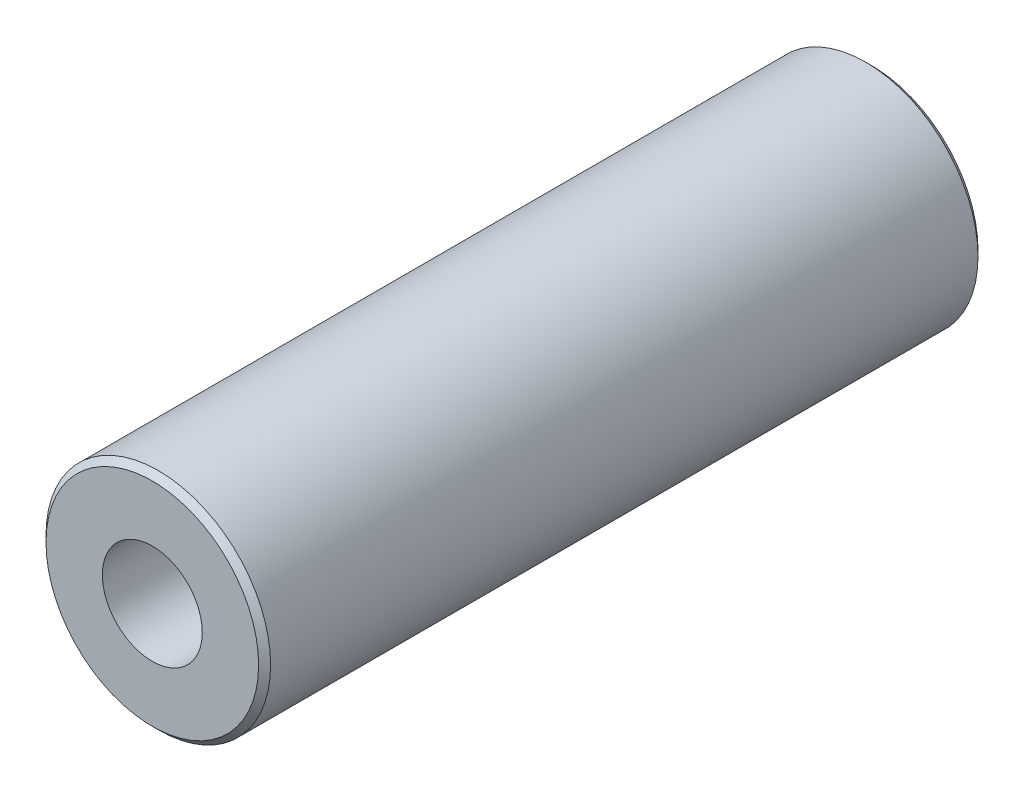
ISO-10303-21;
HEADER;
FILE_DESCRIPTION(('STEP AP214'),'2;1');
FILE_NAME('part.step','',(''),(''),'','','');
FILE_SCHEMA(('AUTOMOTIVE_DESIGN { 1 0 10303 214 1 1 1 1 }'));
ENDSEC;
DATA;
#1=APPLICATION_CONTEXT('core data for automotive mechanical design processes');
#2=APPLICATION_PROTOCOL_DEFINITION('international standard','automotive_design',2000,#1);
#3=PRODUCT_CONTEXT('',#1,'mechanical');
#4=PRODUCT('Part','Part','',(#3));
#5=PRODUCT_RELATED_PRODUCT_CATEGORY('part','',(#4));
#6=PRODUCT_DEFINITION_FORMATION('','',#4);
#7=PRODUCT_DEFINITION_CONTEXT('part definition',#1,'design');
#8=PRODUCT_DEFINITION('design','',#6,#7);
#9=PRODUCT_DEFINITION_SHAPE('','',#8);
#10=(LENGTH_UNIT() NAMED_UNIT(*) SI_UNIT(.MILLI.,.METRE.));
#11=(NAMED_UNIT(*) PLANE_ANGLE_UNIT() SI_UNIT($,.RADIAN.));
#12=(NAMED_UNIT(*) SI_UNIT($,.STERADIAN.) SOLID_ANGLE_UNIT());
#13=UNCERTAINTY_MEASURE_WITH_UNIT(LENGTH_MEASURE(1.E-05),#10,'distance_accuracy_value','');
#14=(GEOMETRIC_REPRESENTATION_CONTEXT(3) GLOBAL_UNCERTAINTY_ASSIGNED_CONTEXT((#13)) GLOBAL_UNIT_ASSIGNED_CONTEXT((#10,
#11,#12)) REPRESENTATION_CONTEXT('',''));
#15=CARTESIAN_POINT('',(0.,0.,0.));
#16=DIRECTION('',(0.,0.,1.));
#17=DIRECTION('',(1.,0.,0.));
#18=AXIS2_PLACEMENT_3D('',#15,#16,#17);
#19=CARTESIAN_POINT('',(0.,0.,-45.72));
#20=DIRECTION('',(0.,0.,1.));
#21=DIRECTION('',(1.,0.,0.));
#22=AXIS2_PLACEMENT_3D('',#19,#20,#21);
#23=CYLINDRICAL_SURFACE('',#22,7.1374);
#24=CARTESIAN_POINT('',(0.,0.,-0.380999999999999));
#25=DIRECTION('',(0.,0.,1.));
#26=DIRECTION('',(1.,0.,0.));
#27=AXIS2_PLACEMENT_3D('',#24,#25,#26);
#28=CIRCLE('',#27,7.1374);
#29=CARTESIAN_POINT('',(7.1374,0.,-0.380999999999999));
#30=VERTEX_POINT('',#29);
#31=EDGE_CURVE('E42',#30,#30,#28,.F.);
#32=ORIENTED_EDGE('',*,*,#31,.T.);
#33=EDGE_LOOP('',(#32));
#34=FACE_BOUND('',#33,.T.);
#35=CARTESIAN_POINT('',(0.,0.,-45.339));
#36=DIRECTION('',(0.,0.,1.));
#37=DIRECTION('',(1.,0.,0.));
#38=AXIS2_PLACEMENT_3D('',#35,#36,#37);
#39=CIRCLE('',#38,7.1374);
#40=CARTESIAN_POINT('',(7.1374,0.,-45.339));
#41=VERTEX_POINT('',#40);
#42=EDGE_CURVE('E46',#41,#41,#39,.T.);
#43=ORIENTED_EDGE('',*,*,#42,.T.);
#44=EDGE_LOOP('',(#43));
#45=FACE_BOUND('',#44,.T.);
#46=ADVANCED_FACE('F35',(#34,#45),#23,.T.);
#47=CARTESIAN_POINT('',(0.,0.,-45.72));
#48=DIRECTION('',(0.,0.,1.));
#49=DIRECTION('',(1.,0.,0.));
#50=AXIS2_PLACEMENT_3D('',#47,#48,#49);
#51=PLANE('',#50);
#52=CARTESIAN_POINT('',(0.,0.,-45.72));
#53=DIRECTION('',(0.,0.,1.));
#54=DIRECTION('',(1.,0.,0.));
#55=AXIS2_PLACEMENT_3D('',#52,#53,#54);
#56=CIRCLE('',#55,6.75640000000001);
#57=CARTESIAN_POINT('',(6.75640000000001,0.,-45.72));
#58=VERTEX_POINT('',#57);
#59=EDGE_CURVE('E10',#58,#58,#56,.F.);
#60=ORIENTED_EDGE('',*,*,#59,.T.);
#61=EDGE_LOOP('',(#60));
#62=FACE_BOUND('',#61,.T.);
#63=CARTESIAN_POINT('',(0.,0.,-45.72));
#64=DIRECTION('',(0.,0.,1.));
#65=DIRECTION('',(1.,0.,0.));
#66=AXIS2_PLACEMENT_3D('',#63,#64,#65);
#67=CIRCLE('',#66,3.175);
#68=CARTESIAN_POINT('',(3.175,0.,-45.72));
#69=VERTEX_POINT('',#68);
#70=EDGE_CURVE('E55',#69,#69,#67,.T.);
#71=ORIENTED_EDGE('',*,*,#70,.T.);
#72=EDGE_LOOP('',(#71));
#73=FACE_BOUND('',#72,.T.);
#74=ADVANCED_FACE('F62',(#62,#73),#51,.F.);
#75=CARTESIAN_POINT('',(0.,0.,0.));
#76=DIRECTION('',(0.,0.,1.));
#77=DIRECTION('',(1.,0.,0.));
#78=AXIS2_PLACEMENT_3D('',#75,#76,#77);
#79=PLANE('',#78);
#80=CARTESIAN_POINT('',(0.,0.,0.));
#81=DIRECTION('',(0.,0.,1.));
#82=DIRECTION('',(1.,0.,0.));
#83=AXIS2_PLACEMENT_3D('',#80,#81,#82);
#84=CIRCLE('',#83,6.7564);
#85=CARTESIAN_POINT('',(6.7564,0.,0.));
#86=VERTEX_POINT('',#85);
#87=EDGE_CURVE('E50',#86,#86,#84,.T.);
#88=ORIENTED_EDGE('',*,*,#87,.T.);
#89=EDGE_LOOP('',(#88));
#90=FACE_BOUND('',#89,.T.);
#91=CARTESIAN_POINT('',(0.,0.,0.));
#92=DIRECTION('',(0.,0.,1.));
#93=DIRECTION('',(1.,0.,0.));
#94=AXIS2_PLACEMENT_3D('',#91,#92,#93);
#95=CIRCLE('',#94,3.175);
#96=CARTESIAN_POINT('',(3.175,0.,0.));
#97=VERTEX_POINT('',#96);
#98=EDGE_CURVE('E56',#97,#97,#95,.T.);
#99=ORIENTED_EDGE('',*,*,#98,.F.);
#100=EDGE_LOOP('',(#99));
#101=FACE_BOUND('',#100,.T.);
#102=ADVANCED_FACE('F68',(#90,#101),#79,.T.);
#103=CARTESIAN_POINT('',(0.,0.,-45.72));
#104=DIRECTION('',(0.,0.,1.));
#105=DIRECTION('',(1.,0.,0.));
#106=AXIS2_PLACEMENT_3D('',#103,#104,#105);
#107=CYLINDRICAL_SURFACE('',#106,3.175);
#108=ORIENTED_EDGE('',*,*,#70,.F.);
#109=EDGE_LOOP('',(#108));
#110=FACE_BOUND('',#109,.T.);
#111=ORIENTED_EDGE('',*,*,#98,.T.);
#112=EDGE_LOOP('',(#111));
#113=FACE_BOUND('',#112,.T.);
#114=ADVANCED_FACE('F64',(#110,#113),#107,.F.);
#115=CARTESIAN_POINT('',(0.,0.,0.));
#116=DIRECTION('',(0.,0.,-1.));
#117=DIRECTION('',(-1.,0.,0.));
#118=AXIS2_PLACEMENT_3D('',#115,#116,#117);
#119=CONICAL_SURFACE('',#118,6.7564,0.785398163397454);
#120=ORIENTED_EDGE('',*,*,#31,.F.);
#121=EDGE_LOOP('',(#120));
#122=FACE_BOUND('',#121,.T.);
#123=ORIENTED_EDGE('',*,*,#87,.F.);
#124=EDGE_LOOP('',(#123));
#125=FACE_BOUND('',#124,.T.);
#126=ADVANCED_FACE('F67',(#122,#125),#119,.T.);
#127=CARTESIAN_POINT('',(0.,0.,-45.339));
#128=DIRECTION('',(0.,0.,1.));
#129=DIRECTION('',(1.,0.,0.));
#130=AXIS2_PLACEMENT_3D('',#127,#128,#129);
#131=CONICAL_SURFACE('',#130,7.1374,0.78539816339744);
#132=ORIENTED_EDGE('',*,*,#59,.F.);
#133=EDGE_LOOP('',(#132));
#134=FACE_BOUND('',#133,.T.);
#135=ORIENTED_EDGE('',*,*,#42,.F.);
#136=EDGE_LOOP('',(#135));
#137=FACE_BOUND('',#136,.T.);
#138=ADVANCED_FACE('F37',(#134,#137),#131,.T.);
#139=CLOSED_SHELL('',(#46,#74,#102,#114,#126,#138));
#140=MANIFOLD_SOLID_BREP('B2',#139);
#141=ADVANCED_BREP_SHAPE_REPRESENTATION('',(#18,#140),#14);
#142=SHAPE_DEFINITION_REPRESENTATION(#9,#141);
ENDSEC;
END-ISO-10303-21;
